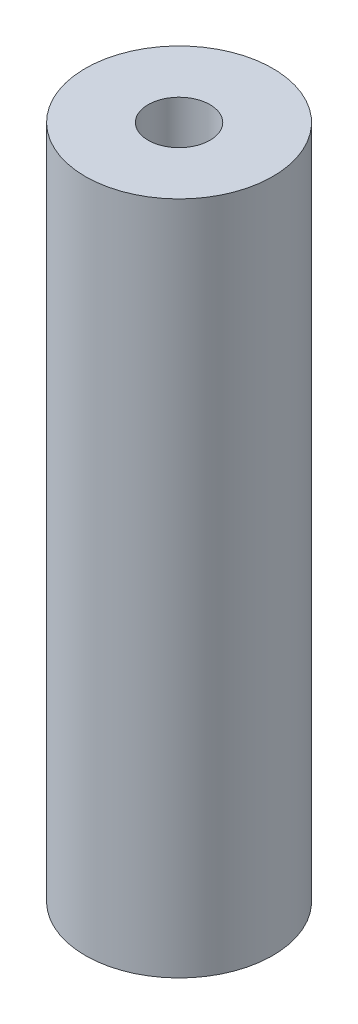
ISO-10303-21;
HEADER;
FILE_DESCRIPTION(('STEP AP214'),'2;1');
FILE_NAME('part.step','',(''),(''),'','','');
FILE_SCHEMA(('AUTOMOTIVE_DESIGN { 1 0 10303 214 1 1 1 1 }'));
ENDSEC;
DATA;
#1=APPLICATION_CONTEXT('core data for automotive mechanical design processes');
#2=APPLICATION_PROTOCOL_DEFINITION('international standard','automotive_design',2000,#1);
#3=PRODUCT_CONTEXT('',#1,'mechanical');
#4=PRODUCT('Part','Part','',(#3));
#5=PRODUCT_RELATED_PRODUCT_CATEGORY('part','',(#4));
#6=PRODUCT_DEFINITION_FORMATION('','',#4);
#7=PRODUCT_DEFINITION_CONTEXT('part definition',#1,'design');
#8=PRODUCT_DEFINITION('design','',#6,#7);
#9=PRODUCT_DEFINITION_SHAPE('','',#8);
#10=(LENGTH_UNIT() NAMED_UNIT(*) SI_UNIT(.MILLI.,.METRE.));
#11=(NAMED_UNIT(*) PLANE_ANGLE_UNIT() SI_UNIT($,.RADIAN.));
#12=(NAMED_UNIT(*) SI_UNIT($,.STERADIAN.) SOLID_ANGLE_UNIT());
#13=UNCERTAINTY_MEASURE_WITH_UNIT(LENGTH_MEASURE(1.E-05),#10,'distance_accuracy_value','');
#14=(GEOMETRIC_REPRESENTATION_CONTEXT(3) GLOBAL_UNCERTAINTY_ASSIGNED_CONTEXT((#13)) GLOBAL_UNIT_ASSIGNED_CONTEXT((#10,
#11,#12)) REPRESENTATION_CONTEXT('',''));
#15=CARTESIAN_POINT('',(0.,0.,0.));
#16=DIRECTION('',(0.,0.,1.));
#17=DIRECTION('',(1.,0.,0.));
#18=AXIS2_PLACEMENT_3D('',#15,#16,#17);
#19=CARTESIAN_POINT('',(0.,36.,0.));
#20=DIRECTION('',(0.,1.,0.));
#21=DIRECTION('',(0.,0.,1.));
#22=AXIS2_PLACEMENT_3D('',#19,#20,#21);
#23=PLANE('',#22);
#24=CARTESIAN_POINT('',(0.,36.,0.));
#25=DIRECTION('',(0.,1.,0.));
#26=DIRECTION('',(0.,0.,1.));
#27=AXIS2_PLACEMENT_3D('',#24,#25,#26);
#28=CIRCLE('',#27,5.);
#29=CARTESIAN_POINT('',(0.,36.,5.));
#30=VERTEX_POINT('',#29);
#31=EDGE_CURVE('E10',#30,#30,#28,.T.);
#32=ORIENTED_EDGE('',*,*,#31,.T.);
#33=EDGE_LOOP('',(#32));
#34=FACE_BOUND('',#33,.T.);
#35=CARTESIAN_POINT('',(0.,36.,0.));
#36=DIRECTION('',(0.,1.,0.));
#37=DIRECTION('',(0.,0.,1.));
#38=AXIS2_PLACEMENT_3D('',#35,#36,#37);
#39=CIRCLE('',#38,1.65);
#40=CARTESIAN_POINT('',(0.,36.,1.65));
#41=VERTEX_POINT('',#40);
#42=EDGE_CURVE('E41',#41,#41,#39,.T.);
#43=ORIENTED_EDGE('',*,*,#42,.F.);
#44=EDGE_LOOP('',(#43));
#45=FACE_BOUND('',#44,.T.);
#46=ADVANCED_FACE('F30',(#34,#45),#23,.T.);
#47=CARTESIAN_POINT('',(0.,0.,0.));
#48=DIRECTION('',(0.,1.,0.));
#49=DIRECTION('',(0.,0.,1.));
#50=AXIS2_PLACEMENT_3D('',#47,#48,#49);
#51=PLANE('',#50);
#52=CARTESIAN_POINT('',(0.,0.,0.));
#53=DIRECTION('',(0.,1.,0.));
#54=DIRECTION('',(0.,0.,1.));
#55=AXIS2_PLACEMENT_3D('',#52,#53,#54);
#56=CIRCLE('',#55,5.);
#57=CARTESIAN_POINT('',(0.,0.,5.));
#58=VERTEX_POINT('',#57);
#59=EDGE_CURVE('E34',#58,#58,#56,.T.);
#60=ORIENTED_EDGE('',*,*,#59,.F.);
#61=EDGE_LOOP('',(#60));
#62=FACE_BOUND('',#61,.T.);
#63=CARTESIAN_POINT('',(0.,0.,0.));
#64=DIRECTION('',(0.,1.,0.));
#65=DIRECTION('',(0.,0.,1.));
#66=AXIS2_PLACEMENT_3D('',#63,#64,#65);
#67=CIRCLE('',#66,1.65);
#68=CARTESIAN_POINT('',(0.,0.,1.65));
#69=VERTEX_POINT('',#68);
#70=EDGE_CURVE('E43',#69,#69,#67,.T.);
#71=ORIENTED_EDGE('',*,*,#70,.T.);
#72=EDGE_LOOP('',(#71));
#73=FACE_BOUND('',#72,.T.);
#74=ADVANCED_FACE('F53',(#62,#73),#51,.F.);
#75=CARTESIAN_POINT('',(0.,36.,0.));
#76=DIRECTION('',(0.,-1.,0.));
#77=DIRECTION('',(0.,0.,-1.));
#78=AXIS2_PLACEMENT_3D('',#75,#76,#77);
#79=CYLINDRICAL_SURFACE('',#78,5.);
#80=ORIENTED_EDGE('',*,*,#31,.F.);
#81=EDGE_LOOP('',(#80));
#82=FACE_BOUND('',#81,.T.);
#83=ORIENTED_EDGE('',*,*,#59,.T.);
#84=EDGE_LOOP('',(#83));
#85=FACE_BOUND('',#84,.T.);
#86=ADVANCED_FACE('F32',(#82,#85),#79,.T.);
#87=CARTESIAN_POINT('',(0.,36.,0.));
#88=DIRECTION('',(0.,-1.,0.));
#89=DIRECTION('',(0.,0.,-1.));
#90=AXIS2_PLACEMENT_3D('',#87,#88,#89);
#91=CYLINDRICAL_SURFACE('',#90,1.65);
#92=ORIENTED_EDGE('',*,*,#42,.T.);
#93=EDGE_LOOP('',(#92));
#94=FACE_BOUND('',#93,.T.);
#95=ORIENTED_EDGE('',*,*,#70,.F.);
#96=EDGE_LOOP('',(#95));
#97=FACE_BOUND('',#96,.T.);
#98=ADVANCED_FACE('F49',(#94,#97),#91,.F.);
#99=CLOSED_SHELL('',(#46,#74,#86,#98));
#100=MANIFOLD_SOLID_BREP('B2',#99);
#101=ADVANCED_BREP_SHAPE_REPRESENTATION('',(#18,#100),#14);
#102=SHAPE_DEFINITION_REPRESENTATION(#9,#101);
ENDSEC;
END-ISO-10303-21;
